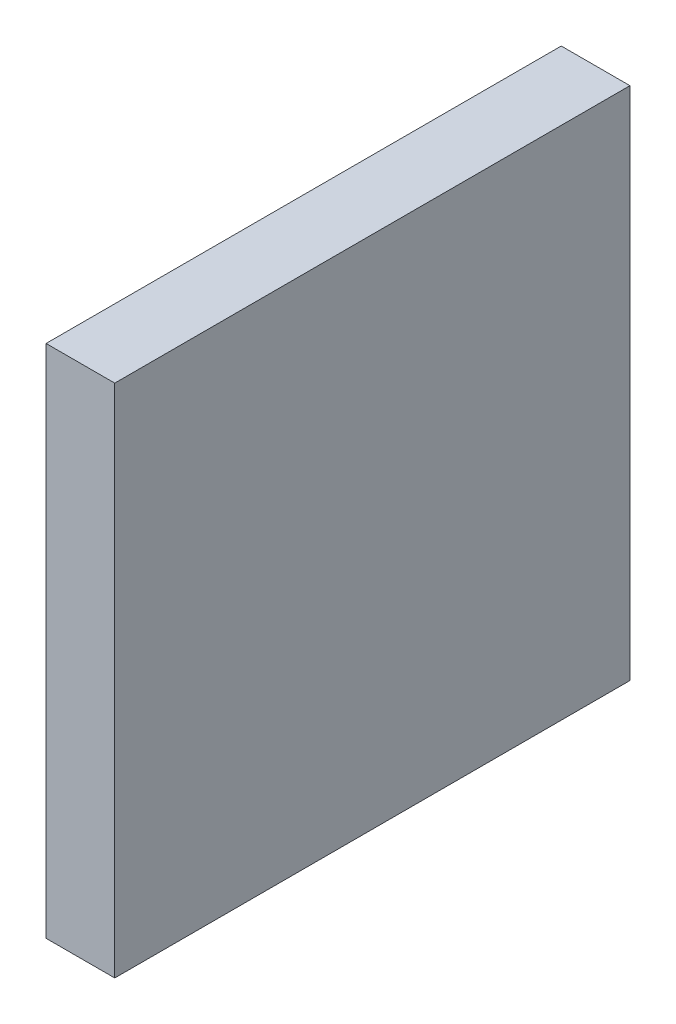
ISO-10303-21;
HEADER;
FILE_DESCRIPTION(('STEP AP214'),'2;1');
FILE_NAME('part.step','',(''),(''),'','','');
FILE_SCHEMA(('AUTOMOTIVE_DESIGN { 1 0 10303 214 1 1 1 1 }'));
ENDSEC;
DATA;
#1=APPLICATION_CONTEXT('core data for automotive mechanical design processes');
#2=APPLICATION_PROTOCOL_DEFINITION('international standard','automotive_design',2000,#1);
#3=PRODUCT_CONTEXT('',#1,'mechanical');
#4=PRODUCT('Part','Part','',(#3));
#5=PRODUCT_RELATED_PRODUCT_CATEGORY('part','',(#4));
#6=PRODUCT_DEFINITION_FORMATION('','',#4);
#7=PRODUCT_DEFINITION_CONTEXT('part definition',#1,'design');
#8=PRODUCT_DEFINITION('design','',#6,#7);
#9=PRODUCT_DEFINITION_SHAPE('','',#8);
#10=(LENGTH_UNIT() NAMED_UNIT(*) SI_UNIT(.MILLI.,.METRE.));
#11=(NAMED_UNIT(*) PLANE_ANGLE_UNIT() SI_UNIT($,.RADIAN.));
#12=(NAMED_UNIT(*) SI_UNIT($,.STERADIAN.) SOLID_ANGLE_UNIT());
#13=UNCERTAINTY_MEASURE_WITH_UNIT(LENGTH_MEASURE(1.E-05),#10,'distance_accuracy_value','');
#14=(GEOMETRIC_REPRESENTATION_CONTEXT(3) GLOBAL_UNCERTAINTY_ASSIGNED_CONTEXT((#13)) GLOBAL_UNIT_ASSIGNED_CONTEXT((#10,
#11,#12)) REPRESENTATION_CONTEXT('',''));
#15=CARTESIAN_POINT('',(0.,0.,0.));
#16=DIRECTION('',(0.,0.,1.));
#17=DIRECTION('',(1.,0.,0.));
#18=AXIS2_PLACEMENT_3D('',#15,#16,#17);
#19=CARTESIAN_POINT('',(3.6,-13.5,13.5));
#20=DIRECTION('',(0.,0.,-1.));
#21=DIRECTION('',(-1.,0.,0.));
#22=AXIS2_PLACEMENT_3D('',#19,#20,#21);
#23=PLANE('',#22);
#24=DIRECTION('',(0.,-1.,0.));
#25=VECTOR('',#24,1.);
#26=CARTESIAN_POINT('',(0.,-13.5,13.5));
#27=LINE('',#26,#25);
#28=CARTESIAN_POINT('',(0.,13.5,13.5));
#29=VERTEX_POINT('',#28);
#30=CARTESIAN_POINT('',(0.,-13.5,13.5));
#31=VERTEX_POINT('',#30);
#32=EDGE_CURVE('E180',#29,#31,#27,.T.);
#33=ORIENTED_EDGE('',*,*,#32,.T.);
#34=DIRECTION('',(-1.,0.,0.));
#35=VECTOR('',#34,1.);
#36=CARTESIAN_POINT('',(3.6,-13.5,13.5));
#37=LINE('',#36,#35);
#38=CARTESIAN_POINT('',(3.6,-13.5,13.5));
#39=VERTEX_POINT('',#38);
#40=EDGE_CURVE('E11',#39,#31,#37,.T.);
#41=ORIENTED_EDGE('',*,*,#40,.F.);
#42=DIRECTION('',(0.,-1.,0.));
#43=VECTOR('',#42,1.);
#44=CARTESIAN_POINT('',(3.6,-13.5,13.5));
#45=LINE('',#44,#43);
#46=CARTESIAN_POINT('',(3.6,13.5,13.5));
#47=VERTEX_POINT('',#46);
#48=EDGE_CURVE('E245',#47,#39,#45,.T.);
#49=ORIENTED_EDGE('',*,*,#48,.F.);
#50=DIRECTION('',(-1.,0.,0.));
#51=VECTOR('',#50,1.);
#52=CARTESIAN_POINT('',(3.6,13.5,13.5));
#53=LINE('',#52,#51);
#54=EDGE_CURVE('E255',#47,#29,#53,.T.);
#55=ORIENTED_EDGE('',*,*,#54,.T.);
#56=EDGE_LOOP('',(#33,#41,#49,#55));
#57=FACE_BOUND('',#56,.T.);
#58=ADVANCED_FACE('F32',(#57),#23,.F.);
#59=CARTESIAN_POINT('',(3.6,-13.5,-13.5));
#60=DIRECTION('',(0.,1.,0.));
#61=DIRECTION('',(0.,0.,1.));
#62=AXIS2_PLACEMENT_3D('',#59,#60,#61);
#63=PLANE('',#62);
#64=DIRECTION('',(0.,0.,-1.));
#65=VECTOR('',#64,1.);
#66=CARTESIAN_POINT('',(0.,-13.5,-13.5));
#67=LINE('',#66,#65);
#68=CARTESIAN_POINT('',(0.,-13.5,-13.5));
#69=VERTEX_POINT('',#68);
#70=EDGE_CURVE('E258',#31,#69,#67,.T.);
#71=ORIENTED_EDGE('',*,*,#70,.T.);
#72=DIRECTION('',(-1.,0.,0.));
#73=VECTOR('',#72,1.);
#74=CARTESIAN_POINT('',(3.6,-13.5,-13.5));
#75=LINE('',#74,#73);
#76=CARTESIAN_POINT('',(3.6,-13.5,-13.5));
#77=VERTEX_POINT('',#76);
#78=EDGE_CURVE('E39',#77,#69,#75,.T.);
#79=ORIENTED_EDGE('',*,*,#78,.F.);
#80=DIRECTION('',(0.,0.,-1.));
#81=VECTOR('',#80,1.);
#82=CARTESIAN_POINT('',(3.6,-13.5,-13.5));
#83=LINE('',#82,#81);
#84=EDGE_CURVE('E248',#39,#77,#83,.T.);
#85=ORIENTED_EDGE('',*,*,#84,.F.);
#86=ORIENTED_EDGE('',*,*,#40,.T.);
#87=EDGE_LOOP('',(#71,#79,#85,#86));
#88=FACE_BOUND('',#87,.T.);
#89=ADVANCED_FACE('F288',(#88),#63,.F.);
#90=CARTESIAN_POINT('',(3.6,-13.5,-13.5));
#91=DIRECTION('',(0.,0.,1.));
#92=DIRECTION('',(1.,0.,0.));
#93=AXIS2_PLACEMENT_3D('',#90,#91,#92);
#94=PLANE('',#93);
#95=DIRECTION('',(0.,1.,0.));
#96=VECTOR('',#95,1.);
#97=CARTESIAN_POINT('',(0.,-13.5,-13.5));
#98=LINE('',#97,#96);
#99=CARTESIAN_POINT('',(0.,13.5,-13.5));
#100=VERTEX_POINT('',#99);
#101=EDGE_CURVE('E260',#69,#100,#98,.T.);
#102=ORIENTED_EDGE('',*,*,#101,.T.);
#103=DIRECTION('',(-1.,0.,0.));
#104=VECTOR('',#103,1.);
#105=CARTESIAN_POINT('',(3.6,13.5,-13.5));
#106=LINE('',#105,#104);
#107=CARTESIAN_POINT('',(3.6,13.5,-13.5));
#108=VERTEX_POINT('',#107);
#109=EDGE_CURVE('E265',#108,#100,#106,.T.);
#110=ORIENTED_EDGE('',*,*,#109,.F.);
#111=DIRECTION('',(0.,1.,0.));
#112=VECTOR('',#111,1.);
#113=CARTESIAN_POINT('',(3.6,-13.5,-13.5));
#114=LINE('',#113,#112);
#115=EDGE_CURVE('E251',#77,#108,#114,.T.);
#116=ORIENTED_EDGE('',*,*,#115,.F.);
#117=ORIENTED_EDGE('',*,*,#78,.T.);
#118=EDGE_LOOP('',(#102,#110,#116,#117));
#119=FACE_BOUND('',#118,.T.);
#120=ADVANCED_FACE('F272',(#119),#94,.F.);
#121=CARTESIAN_POINT('',(3.6,13.5,-13.5));
#122=DIRECTION('',(0.,-1.,0.));
#123=DIRECTION('',(0.,0.,-1.));
#124=AXIS2_PLACEMENT_3D('',#121,#122,#123);
#125=PLANE('',#124);
#126=DIRECTION('',(0.,0.,1.));
#127=VECTOR('',#126,1.);
#128=CARTESIAN_POINT('',(0.,13.5,-13.5));
#129=LINE('',#128,#127);
#130=EDGE_CURVE('E249',#100,#29,#129,.T.);
#131=ORIENTED_EDGE('',*,*,#130,.T.);
#132=ORIENTED_EDGE('',*,*,#54,.F.);
#133=DIRECTION('',(0.,0.,1.));
#134=VECTOR('',#133,1.);
#135=CARTESIAN_POINT('',(3.6,13.5,-13.5));
#136=LINE('',#135,#134);
#137=EDGE_CURVE('E253',#108,#47,#136,.T.);
#138=ORIENTED_EDGE('',*,*,#137,.F.);
#139=ORIENTED_EDGE('',*,*,#109,.T.);
#140=EDGE_LOOP('',(#131,#132,#138,#139));
#141=FACE_BOUND('',#140,.T.);
#142=ADVANCED_FACE('F281',(#141),#125,.F.);
#143=CARTESIAN_POINT('',(3.6,0.,0.));
#144=DIRECTION('',(1.,0.,0.));
#145=DIRECTION('',(0.,0.,-1.));
#146=AXIS2_PLACEMENT_3D('',#143,#144,#145);
#147=PLANE('',#146);
#148=ORIENTED_EDGE('',*,*,#48,.T.);
#149=ORIENTED_EDGE('',*,*,#84,.T.);
#150=ORIENTED_EDGE('',*,*,#115,.T.);
#151=ORIENTED_EDGE('',*,*,#137,.T.);
#152=EDGE_LOOP('',(#148,#149,#150,#151));
#153=FACE_BOUND('',#152,.T.);
#154=ADVANCED_FACE('F287',(#153),#147,.T.);
#155=CARTESIAN_POINT('',(0.,0.,0.));
#156=DIRECTION('',(1.,0.,0.));
#157=DIRECTION('',(0.,0.,-1.));
#158=AXIS2_PLACEMENT_3D('',#155,#156,#157);
#159=PLANE('',#158);
#160=DIRECTION('',(0.,0.,1.));
#161=VECTOR('',#160,1.);
#162=CARTESIAN_POINT('',(0.,-0.499999999999998,-5.75));
#163=LINE('',#162,#161);
#164=CARTESIAN_POINT('',(0.,-0.499999999999998,-9.25));
#165=VERTEX_POINT('',#164);
#166=CARTESIAN_POINT('',(0.,-0.499999999999998,-5.75));
#167=VERTEX_POINT('',#166);
#168=EDGE_CURVE('E173',#165,#167,#163,.T.);
#169=ORIENTED_EDGE('',*,*,#168,.F.);
#170=DIRECTION('',(0.,-1.,0.));
#171=VECTOR('',#170,1.);
#172=CARTESIAN_POINT('',(0.,9.5,-9.25));
#173=LINE('',#172,#171);
#174=CARTESIAN_POINT('',(0.,9.5,-9.25));
#175=VERTEX_POINT('',#174);
#176=EDGE_CURVE('E46',#175,#165,#173,.T.);
#177=ORIENTED_EDGE('',*,*,#176,.F.);
#178=DIRECTION('',(0.,0.,-1.));
#179=VECTOR('',#178,1.);
#180=CARTESIAN_POINT('',(0.,9.5,-5.75));
#181=LINE('',#180,#179);
#182=CARTESIAN_POINT('',(0.,9.5,-5.75));
#183=VERTEX_POINT('',#182);
#184=EDGE_CURVE('E164',#183,#175,#181,.T.);
#185=ORIENTED_EDGE('',*,*,#184,.F.);
#186=DIRECTION('',(0.,1.,0.));
#187=VECTOR('',#186,1.);
#188=CARTESIAN_POINT('',(0.,9.5,-5.75));
#189=LINE('',#188,#187);
#190=EDGE_CURVE('E167',#167,#183,#189,.T.);
#191=ORIENTED_EDGE('',*,*,#190,.F.);
#192=EDGE_LOOP('',(#169,#177,#185,#191));
#193=FACE_BOUND('',#192,.T.);
#194=DIRECTION('',(0.,0.,1.));
#195=VECTOR('',#194,1.);
#196=CARTESIAN_POINT('',(0.,-0.499999999999998,9.25));
#197=LINE('',#196,#195);
#198=CARTESIAN_POINT('',(0.,-0.500000000000001,5.75));
#199=VERTEX_POINT('',#198);
#200=CARTESIAN_POINT('',(0.,-0.499999999999998,9.25));
#201=VERTEX_POINT('',#200);
#202=EDGE_CURVE('E199',#199,#201,#197,.T.);
#203=ORIENTED_EDGE('',*,*,#202,.F.);
#204=DIRECTION('',(0.,-1.,0.));
#205=VECTOR('',#204,1.);
#206=CARTESIAN_POINT('',(0.,9.5,5.75));
#207=LINE('',#206,#205);
#208=CARTESIAN_POINT('',(0.,9.5,5.75));
#209=VERTEX_POINT('',#208);
#210=EDGE_CURVE('E54',#209,#199,#207,.T.);
#211=ORIENTED_EDGE('',*,*,#210,.F.);
#212=DIRECTION('',(0.,0.,-1.));
#213=VECTOR('',#212,1.);
#214=CARTESIAN_POINT('',(0.,9.5,9.25));
#215=LINE('',#214,#213);
#216=CARTESIAN_POINT('',(0.,9.5,9.25));
#217=VERTEX_POINT('',#216);
#218=EDGE_CURVE('E188',#217,#209,#215,.T.);
#219=ORIENTED_EDGE('',*,*,#218,.F.);
#220=DIRECTION('',(0.,1.,0.));
#221=VECTOR('',#220,1.);
#222=CARTESIAN_POINT('',(0.,9.5,9.25));
#223=LINE('',#222,#221);
#224=EDGE_CURVE('E203',#201,#217,#223,.T.);
#225=ORIENTED_EDGE('',*,*,#224,.F.);
#226=EDGE_LOOP('',(#203,#211,#219,#225));
#227=FACE_BOUND('',#226,.T.);
#228=DIRECTION('',(0.,-1.,0.));
#229=VECTOR('',#228,1.);
#230=CARTESIAN_POINT('',(0.,-7.,-2.5));
#231=LINE('',#230,#229);
#232=CARTESIAN_POINT('',(0.,-7.,-2.5));
#233=VERTEX_POINT('',#232);
#234=CARTESIAN_POINT('',(0.,-9.,-2.5));
#235=VERTEX_POINT('',#234);
#236=EDGE_CURVE('E230',#233,#235,#231,.T.);
#237=ORIENTED_EDGE('',*,*,#236,.F.);
#238=CARTESIAN_POINT('',(0.,-7.,0.));
#239=DIRECTION('',(-1.,0.,0.));
#240=DIRECTION('',(0.,0.,-1.));
#241=AXIS2_PLACEMENT_3D('',#238,#239,#240);
#242=CIRCLE('',#241,2.5);
#243=CARTESIAN_POINT('',(0.,-7.,2.5));
#244=VERTEX_POINT('',#243);
#245=EDGE_CURVE('E228',#244,#233,#242,.T.);
#246=ORIENTED_EDGE('',*,*,#245,.F.);
#247=DIRECTION('',(0.,1.,0.));
#248=VECTOR('',#247,1.);
#249=CARTESIAN_POINT('',(0.,-9.,2.5));
#250=LINE('',#249,#248);
#251=CARTESIAN_POINT('',(0.,-9.,2.5));
#252=VERTEX_POINT('',#251);
#253=EDGE_CURVE('E218',#252,#244,#250,.T.);
#254=ORIENTED_EDGE('',*,*,#253,.F.);
#255=DIRECTION('',(0.,0.,1.));
#256=VECTOR('',#255,1.);
#257=CARTESIAN_POINT('',(0.,-9.,-2.5));
#258=LINE('',#257,#256);
#259=EDGE_CURVE('E233',#235,#252,#258,.T.);
#260=ORIENTED_EDGE('',*,*,#259,.F.);
#261=EDGE_LOOP('',(#237,#246,#254,#260));
#262=FACE_BOUND('',#261,.T.);
#263=ORIENTED_EDGE('',*,*,#32,.F.);
#264=ORIENTED_EDGE('',*,*,#130,.F.);
#265=ORIENTED_EDGE('',*,*,#101,.F.);
#266=ORIENTED_EDGE('',*,*,#70,.F.);
#267=EDGE_LOOP('',(#263,#264,#265,#266));
#268=FACE_BOUND('',#267,.T.);
#269=ADVANCED_FACE('F278',(#193,#227,#262,#268),#159,.F.);
#270=CARTESIAN_POINT('',(3.,-7.,0.));
#271=DIRECTION('',(-1.,0.,0.));
#272=DIRECTION('',(0.,0.,1.));
#273=AXIS2_PLACEMENT_3D('',#270,#271,#272);
#274=CYLINDRICAL_SURFACE('',#273,2.5);
#275=ORIENTED_EDGE('',*,*,#245,.T.);
#276=DIRECTION('',(-1.,0.,0.));
#277=VECTOR('',#276,1.);
#278=CARTESIAN_POINT('',(3.,-7.,-2.5));
#279=LINE('',#278,#277);
#280=CARTESIAN_POINT('',(3.,-7.,-2.5));
#281=VERTEX_POINT('',#280);
#282=EDGE_CURVE('E227',#281,#233,#279,.T.);
#283=ORIENTED_EDGE('',*,*,#282,.F.);
#284=CARTESIAN_POINT('',(3.,-7.,0.));
#285=DIRECTION('',(-1.,0.,0.));
#286=DIRECTION('',(0.,0.,-1.));
#287=AXIS2_PLACEMENT_3D('',#284,#285,#286);
#288=CIRCLE('',#287,2.5);
#289=CARTESIAN_POINT('',(3.,-7.,2.5));
#290=VERTEX_POINT('',#289);
#291=EDGE_CURVE('E214',#290,#281,#288,.T.);
#292=ORIENTED_EDGE('',*,*,#291,.F.);
#293=DIRECTION('',(-1.,0.,0.));
#294=VECTOR('',#293,1.);
#295=CARTESIAN_POINT('',(3.,-7.,2.5));
#296=LINE('',#295,#294);
#297=EDGE_CURVE('E200',#290,#244,#296,.T.);
#298=ORIENTED_EDGE('',*,*,#297,.T.);
#299=EDGE_LOOP('',(#275,#283,#292,#298));
#300=FACE_BOUND('',#299,.T.);
#301=ADVANCED_FACE('F300',(#300),#274,.F.);
#302=CARTESIAN_POINT('',(3.,-9.,2.5));
#303=DIRECTION('',(0.,0.,1.));
#304=DIRECTION('',(1.,0.,0.));
#305=AXIS2_PLACEMENT_3D('',#302,#303,#304);
#306=PLANE('',#305);
#307=ORIENTED_EDGE('',*,*,#253,.T.);
#308=ORIENTED_EDGE('',*,*,#297,.F.);
#309=DIRECTION('',(0.,1.,0.));
#310=VECTOR('',#309,1.);
#311=CARTESIAN_POINT('',(3.,-9.,2.5));
#312=LINE('',#311,#310);
#313=CARTESIAN_POINT('',(3.,-9.,2.5));
#314=VERTEX_POINT('',#313);
#315=EDGE_CURVE('E224',#314,#290,#312,.T.);
#316=ORIENTED_EDGE('',*,*,#315,.F.);
#317=DIRECTION('',(-1.,0.,0.));
#318=VECTOR('',#317,1.);
#319=CARTESIAN_POINT('',(3.,-9.,2.5));
#320=LINE('',#319,#318);
#321=EDGE_CURVE('E239',#314,#252,#320,.T.);
#322=ORIENTED_EDGE('',*,*,#321,.T.);
#323=EDGE_LOOP('',(#307,#308,#316,#322));
#324=FACE_BOUND('',#323,.T.);
#325=ADVANCED_FACE('F306',(#324),#306,.F.);
#326=CARTESIAN_POINT('',(3.,-9.,-2.5));
#327=DIRECTION('',(0.,-1.,0.));
#328=DIRECTION('',(0.,0.,-1.));
#329=AXIS2_PLACEMENT_3D('',#326,#327,#328);
#330=PLANE('',#329);
#331=ORIENTED_EDGE('',*,*,#259,.T.);
#332=ORIENTED_EDGE('',*,*,#321,.F.);
#333=DIRECTION('',(0.,0.,1.));
#334=VECTOR('',#333,1.);
#335=CARTESIAN_POINT('',(3.,-9.,-2.5));
#336=LINE('',#335,#334);
#337=CARTESIAN_POINT('',(3.,-9.,-2.5));
#338=VERTEX_POINT('',#337);
#339=EDGE_CURVE('E221',#338,#314,#336,.T.);
#340=ORIENTED_EDGE('',*,*,#339,.F.);
#341=DIRECTION('',(-1.,0.,0.));
#342=VECTOR('',#341,1.);
#343=CARTESIAN_POINT('',(3.,-9.,-2.5));
#344=LINE('',#343,#342);
#345=EDGE_CURVE('E241',#338,#235,#344,.T.);
#346=ORIENTED_EDGE('',*,*,#345,.T.);
#347=EDGE_LOOP('',(#331,#332,#340,#346));
#348=FACE_BOUND('',#347,.T.);
#349=ADVANCED_FACE('F312',(#348),#330,.F.);
#350=CARTESIAN_POINT('',(3.,-7.,-2.5));
#351=DIRECTION('',(0.,0.,-1.));
#352=DIRECTION('',(0.,1.,0.));
#353=AXIS2_PLACEMENT_3D('',#350,#351,#352);
#354=PLANE('',#353);
#355=ORIENTED_EDGE('',*,*,#236,.T.);
#356=ORIENTED_EDGE('',*,*,#345,.F.);
#357=DIRECTION('',(0.,-1.,0.));
#358=VECTOR('',#357,1.);
#359=CARTESIAN_POINT('',(3.,-7.,-2.5));
#360=LINE('',#359,#358);
#361=EDGE_CURVE('E217',#281,#338,#360,.T.);
#362=ORIENTED_EDGE('',*,*,#361,.F.);
#363=ORIENTED_EDGE('',*,*,#282,.T.);
#364=EDGE_LOOP('',(#355,#356,#362,#363));
#365=FACE_BOUND('',#364,.T.);
#366=ADVANCED_FACE('F308',(#365),#354,.F.);
#367=CARTESIAN_POINT('',(3.,-7.,0.));
#368=DIRECTION('',(1.,0.,0.));
#369=DIRECTION('',(0.,0.,-1.));
#370=AXIS2_PLACEMENT_3D('',#367,#368,#369);
#371=PLANE('',#370);
#372=ORIENTED_EDGE('',*,*,#291,.T.);
#373=ORIENTED_EDGE('',*,*,#361,.T.);
#374=ORIENTED_EDGE('',*,*,#339,.T.);
#375=ORIENTED_EDGE('',*,*,#315,.T.);
#376=EDGE_LOOP('',(#372,#373,#374,#375));
#377=FACE_BOUND('',#376,.T.);
#378=ADVANCED_FACE('F311',(#377),#371,.F.);
#379=CARTESIAN_POINT('',(3.,9.5,5.75));
#380=DIRECTION('',(0.,0.,-1.));
#381=DIRECTION('',(0.,1.,0.));
#382=AXIS2_PLACEMENT_3D('',#379,#380,#381);
#383=PLANE('',#382);
#384=ORIENTED_EDGE('',*,*,#210,.T.);
#385=DIRECTION('',(-1.,0.,0.));
#386=VECTOR('',#385,1.);
#387=CARTESIAN_POINT('',(3.,-0.500000000000001,5.75));
#388=LINE('',#387,#386);
#389=CARTESIAN_POINT('',(3.,-0.500000000000001,5.75));
#390=VERTEX_POINT('',#389);
#391=EDGE_CURVE('E197',#390,#199,#388,.T.);
#392=ORIENTED_EDGE('',*,*,#391,.F.);
#393=DIRECTION('',(0.,-1.,0.));
#394=VECTOR('',#393,1.);
#395=CARTESIAN_POINT('',(3.,9.5,5.75));
#396=LINE('',#395,#394);
#397=CARTESIAN_POINT('',(3.,9.5,5.75));
#398=VERTEX_POINT('',#397);
#399=EDGE_CURVE('E184',#398,#390,#396,.T.);
#400=ORIENTED_EDGE('',*,*,#399,.F.);
#401=DIRECTION('',(-1.,0.,0.));
#402=VECTOR('',#401,1.);
#403=CARTESIAN_POINT('',(3.,9.5,5.75));
#404=LINE('',#403,#402);
#405=EDGE_CURVE('E174',#398,#209,#404,.T.);
#406=ORIENTED_EDGE('',*,*,#405,.T.);
#407=EDGE_LOOP('',(#384,#392,#400,#406));
#408=FACE_BOUND('',#407,.T.);
#409=ADVANCED_FACE('F322',(#408),#383,.F.);
#410=CARTESIAN_POINT('',(3.,9.5,9.25));
#411=DIRECTION('',(0.,1.,0.));
#412=DIRECTION('',(0.,0.,1.));
#413=AXIS2_PLACEMENT_3D('',#410,#411,#412);
#414=PLANE('',#413);
#415=ORIENTED_EDGE('',*,*,#218,.T.);
#416=ORIENTED_EDGE('',*,*,#405,.F.);
#417=DIRECTION('',(0.,0.,-1.));
#418=VECTOR('',#417,1.);
#419=CARTESIAN_POINT('',(3.,9.5,9.25));
#420=LINE('',#419,#418);
#421=CARTESIAN_POINT('',(3.,9.5,9.25));
#422=VERTEX_POINT('',#421);
#423=EDGE_CURVE('E194',#422,#398,#420,.T.);
#424=ORIENTED_EDGE('',*,*,#423,.F.);
#425=DIRECTION('',(-1.,0.,0.));
#426=VECTOR('',#425,1.);
#427=CARTESIAN_POINT('',(3.,9.5,9.25));
#428=LINE('',#427,#426);
#429=EDGE_CURVE('E209',#422,#217,#428,.T.);
#430=ORIENTED_EDGE('',*,*,#429,.T.);
#431=EDGE_LOOP('',(#415,#416,#424,#430));
#432=FACE_BOUND('',#431,.T.);
#433=ADVANCED_FACE('F326',(#432),#414,.F.);
#434=CARTESIAN_POINT('',(3.,9.5,9.25));
#435=DIRECTION('',(0.,0.,1.));
#436=DIRECTION('',(1.,0.,0.));
#437=AXIS2_PLACEMENT_3D('',#434,#435,#436);
#438=PLANE('',#437);
#439=ORIENTED_EDGE('',*,*,#224,.T.);
#440=ORIENTED_EDGE('',*,*,#429,.F.);
#441=DIRECTION('',(0.,1.,0.));
#442=VECTOR('',#441,1.);
#443=CARTESIAN_POINT('',(3.,9.5,9.25));
#444=LINE('',#443,#442);
#445=CARTESIAN_POINT('',(3.,-0.499999999999998,9.25));
#446=VERTEX_POINT('',#445);
#447=EDGE_CURVE('E191',#446,#422,#444,.T.);
#448=ORIENTED_EDGE('',*,*,#447,.F.);
#449=DIRECTION('',(-1.,0.,0.));
#450=VECTOR('',#449,1.);
#451=CARTESIAN_POINT('',(3.,-0.499999999999998,9.25));
#452=LINE('',#451,#450);
#453=EDGE_CURVE('E211',#446,#201,#452,.T.);
#454=ORIENTED_EDGE('',*,*,#453,.T.);
#455=EDGE_LOOP('',(#439,#440,#448,#454));
#456=FACE_BOUND('',#455,.T.);
#457=ADVANCED_FACE('F331',(#456),#438,.F.);
#458=CARTESIAN_POINT('',(3.,-0.499999999999998,9.25));
#459=DIRECTION('',(0.,-1.,0.));
#460=DIRECTION('',(0.,0.,-1.));
#461=AXIS2_PLACEMENT_3D('',#458,#459,#460);
#462=PLANE('',#461);
#463=ORIENTED_EDGE('',*,*,#202,.T.);
#464=ORIENTED_EDGE('',*,*,#453,.F.);
#465=DIRECTION('',(0.,0.,1.));
#466=VECTOR('',#465,1.);
#467=CARTESIAN_POINT('',(3.,-0.499999999999998,9.25));
#468=LINE('',#467,#466);
#469=EDGE_CURVE('E187',#390,#446,#468,.T.);
#470=ORIENTED_EDGE('',*,*,#469,.F.);
#471=ORIENTED_EDGE('',*,*,#391,.T.);
#472=EDGE_LOOP('',(#463,#464,#470,#471));
#473=FACE_BOUND('',#472,.T.);
#474=ADVANCED_FACE('F327',(#473),#462,.F.);
#475=CARTESIAN_POINT('',(3.,0.,0.));
#476=DIRECTION('',(1.,0.,0.));
#477=DIRECTION('',(0.,0.,-1.));
#478=AXIS2_PLACEMENT_3D('',#475,#476,#477);
#479=PLANE('',#478);
#480=ORIENTED_EDGE('',*,*,#399,.T.);
#481=ORIENTED_EDGE('',*,*,#469,.T.);
#482=ORIENTED_EDGE('',*,*,#447,.T.);
#483=ORIENTED_EDGE('',*,*,#423,.T.);
#484=EDGE_LOOP('',(#480,#481,#482,#483));
#485=FACE_BOUND('',#484,.T.);
#486=ADVANCED_FACE('F330',(#485),#479,.F.);
#487=CARTESIAN_POINT('',(3.,9.5,-9.25));
#488=DIRECTION('',(0.,0.,-1.));
#489=DIRECTION('',(-1.,0.,0.));
#490=AXIS2_PLACEMENT_3D('',#487,#488,#489);
#491=PLANE('',#490);
#492=ORIENTED_EDGE('',*,*,#176,.T.);
#493=DIRECTION('',(-1.,0.,0.));
#494=VECTOR('',#493,1.);
#495=CARTESIAN_POINT('',(3.,-0.499999999999998,-9.25));
#496=LINE('',#495,#494);
#497=CARTESIAN_POINT('',(3.,-0.499999999999998,-9.25));
#498=VERTEX_POINT('',#497);
#499=EDGE_CURVE('E142',#498,#165,#496,.T.);
#500=ORIENTED_EDGE('',*,*,#499,.F.);
#501=DIRECTION('',(0.,-1.,0.));
#502=VECTOR('',#501,1.);
#503=CARTESIAN_POINT('',(3.,9.5,-9.25));
#504=LINE('',#503,#502);
#505=CARTESIAN_POINT('',(3.,9.5,-9.25));
#506=VERTEX_POINT('',#505);
#507=EDGE_CURVE('E146',#506,#498,#504,.T.);
#508=ORIENTED_EDGE('',*,*,#507,.F.);
#509=DIRECTION('',(-1.,0.,0.));
#510=VECTOR('',#509,1.);
#511=CARTESIAN_POINT('',(3.,9.5,-9.25));
#512=LINE('',#511,#510);
#513=EDGE_CURVE('E178',#506,#175,#512,.T.);
#514=ORIENTED_EDGE('',*,*,#513,.T.);
#515=EDGE_LOOP('',(#492,#500,#508,#514));
#516=FACE_BOUND('',#515,.T.);
#517=ADVANCED_FACE('F144',(#516),#491,.F.);
#518=CARTESIAN_POINT('',(3.,9.5,-5.75));
#519=DIRECTION('',(0.,1.,0.));
#520=DIRECTION('',(0.,0.,1.));
#521=AXIS2_PLACEMENT_3D('',#518,#519,#520);
#522=PLANE('',#521);
#523=ORIENTED_EDGE('',*,*,#184,.T.);
#524=ORIENTED_EDGE('',*,*,#513,.F.);
#525=DIRECTION('',(0.,0.,-1.));
#526=VECTOR('',#525,1.);
#527=CARTESIAN_POINT('',(3.,9.5,-5.75));
#528=LINE('',#527,#526);
#529=CARTESIAN_POINT('',(3.,9.5,-5.75));
#530=VERTEX_POINT('',#529);
#531=EDGE_CURVE('E152',#530,#506,#528,.T.);
#532=ORIENTED_EDGE('',*,*,#531,.F.);
#533=DIRECTION('',(-1.,0.,0.));
#534=VECTOR('',#533,1.);
#535=CARTESIAN_POINT('',(3.,9.5,-5.75));
#536=LINE('',#535,#534);
#537=EDGE_CURVE('E181',#530,#183,#536,.T.);
#538=ORIENTED_EDGE('',*,*,#537,.T.);
#539=EDGE_LOOP('',(#523,#524,#532,#538));
#540=FACE_BOUND('',#539,.T.);
#541=ADVANCED_FACE('F344',(#540),#522,.F.);
#542=CARTESIAN_POINT('',(3.,9.5,-5.75));
#543=DIRECTION('',(0.,0.,1.));
#544=DIRECTION('',(1.,0.,0.));
#545=AXIS2_PLACEMENT_3D('',#542,#543,#544);
#546=PLANE('',#545);
#547=ORIENTED_EDGE('',*,*,#190,.T.);
#548=ORIENTED_EDGE('',*,*,#537,.F.);
#549=DIRECTION('',(0.,1.,0.));
#550=VECTOR('',#549,1.);
#551=CARTESIAN_POINT('',(3.,9.5,-5.75));
#552=LINE('',#551,#550);
#553=CARTESIAN_POINT('',(3.,-0.499999999999998,-5.75));
#554=VERTEX_POINT('',#553);
#555=EDGE_CURVE('E160',#554,#530,#552,.T.);
#556=ORIENTED_EDGE('',*,*,#555,.F.);
#557=DIRECTION('',(-1.,0.,0.));
#558=VECTOR('',#557,1.);
#559=CARTESIAN_POINT('',(3.,-0.499999999999998,-5.75));
#560=LINE('',#559,#558);
#561=EDGE_CURVE('E151',#554,#167,#560,.T.);
#562=ORIENTED_EDGE('',*,*,#561,.T.);
#563=EDGE_LOOP('',(#547,#548,#556,#562));
#564=FACE_BOUND('',#563,.T.);
#565=ADVANCED_FACE('F347',(#564),#546,.F.);
#566=CARTESIAN_POINT('',(3.,-0.499999999999998,-5.75));
#567=DIRECTION('',(0.,-1.,0.));
#568=DIRECTION('',(0.,0.,-1.));
#569=AXIS2_PLACEMENT_3D('',#566,#567,#568);
#570=PLANE('',#569);
#571=ORIENTED_EDGE('',*,*,#168,.T.);
#572=ORIENTED_EDGE('',*,*,#561,.F.);
#573=DIRECTION('',(0.,0.,1.));
#574=VECTOR('',#573,1.);
#575=CARTESIAN_POINT('',(3.,-0.499999999999998,-5.75));
#576=LINE('',#575,#574);
#577=EDGE_CURVE('E155',#498,#554,#576,.T.);
#578=ORIENTED_EDGE('',*,*,#577,.F.);
#579=ORIENTED_EDGE('',*,*,#499,.T.);
#580=EDGE_LOOP('',(#571,#572,#578,#579));
#581=FACE_BOUND('',#580,.T.);
#582=ADVANCED_FACE('F156',(#581),#570,.F.);
#583=CARTESIAN_POINT('',(3.,0.,0.));
#584=DIRECTION('',(1.,0.,0.));
#585=DIRECTION('',(0.,0.,-1.));
#586=AXIS2_PLACEMENT_3D('',#583,#584,#585);
#587=PLANE('',#586);
#588=ORIENTED_EDGE('',*,*,#507,.T.);
#589=ORIENTED_EDGE('',*,*,#577,.T.);
#590=ORIENTED_EDGE('',*,*,#555,.T.);
#591=ORIENTED_EDGE('',*,*,#531,.T.);
#592=EDGE_LOOP('',(#588,#589,#590,#591));
#593=FACE_BOUND('',#592,.T.);
#594=ADVANCED_FACE('F162',(#593),#587,.F.);
#595=CLOSED_SHELL('',(#58,#89,#120,#142,#154,#269,#301,#325,#349,#366,#378,#409,#433,#457,#474,
#486,#517,#541,#565,#582,#594));
#596=MANIFOLD_SOLID_BREP('B2',#595);
#597=ADVANCED_BREP_SHAPE_REPRESENTATION('',(#18,#596),#14);
#598=SHAPE_DEFINITION_REPRESENTATION(#9,#597);
ENDSEC;
END-ISO-10303-21;
